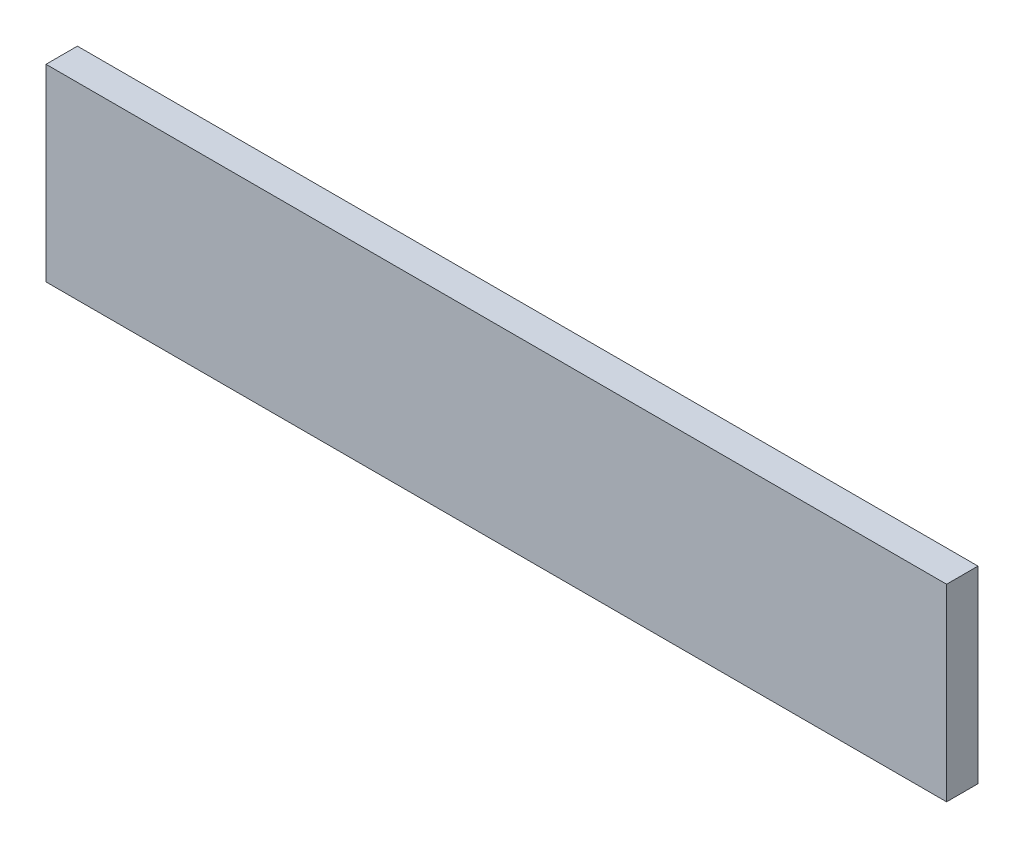
ISO-10303-21;
HEADER;
FILE_DESCRIPTION(('STEP AP214'),'2;1');
FILE_NAME('part.step','',(''),(''),'','','');
FILE_SCHEMA(('AUTOMOTIVE_DESIGN { 1 0 10303 214 1 1 1 1 }'));
ENDSEC;
DATA;
#1=APPLICATION_CONTEXT('core data for automotive mechanical design processes');
#2=APPLICATION_PROTOCOL_DEFINITION('international standard','automotive_design',2000,#1);
#3=PRODUCT_CONTEXT('',#1,'mechanical');
#4=PRODUCT('Part','Part','',(#3));
#5=PRODUCT_RELATED_PRODUCT_CATEGORY('part','',(#4));
#6=PRODUCT_DEFINITION_FORMATION('','',#4);
#7=PRODUCT_DEFINITION_CONTEXT('part definition',#1,'design');
#8=PRODUCT_DEFINITION('design','',#6,#7);
#9=PRODUCT_DEFINITION_SHAPE('','',#8);
#10=(LENGTH_UNIT() NAMED_UNIT(*) SI_UNIT(.MILLI.,.METRE.));
#11=(NAMED_UNIT(*) PLANE_ANGLE_UNIT() SI_UNIT($,.RADIAN.));
#12=(NAMED_UNIT(*) SI_UNIT($,.STERADIAN.) SOLID_ANGLE_UNIT());
#13=UNCERTAINTY_MEASURE_WITH_UNIT(LENGTH_MEASURE(1.E-05),#10,'distance_accuracy_value','');
#14=(GEOMETRIC_REPRESENTATION_CONTEXT(3) GLOBAL_UNCERTAINTY_ASSIGNED_CONTEXT((#13)) GLOBAL_UNIT_ASSIGNED_CONTEXT((#10,
#11,#12)) REPRESENTATION_CONTEXT('',''));
#15=CARTESIAN_POINT('',(0.,0.,0.));
#16=DIRECTION('',(0.,0.,1.));
#17=DIRECTION('',(1.,0.,0.));
#18=AXIS2_PLACEMENT_3D('',#15,#16,#17);
#19=CARTESIAN_POINT('',(43.,-9.,3.));
#20=DIRECTION('',(-1.,0.,0.));
#21=DIRECTION('',(0.,0.,1.));
#22=AXIS2_PLACEMENT_3D('',#19,#20,#21);
#23=PLANE('',#22);
#24=DIRECTION('',(0.,1.,0.));
#25=VECTOR('',#24,1.);
#26=CARTESIAN_POINT('',(43.,-9.,0.));
#27=LINE('',#26,#25);
#28=CARTESIAN_POINT('',(43.,-9.,0.));
#29=VERTEX_POINT('',#28);
#30=CARTESIAN_POINT('',(43.,9.,0.));
#31=VERTEX_POINT('',#30);
#32=EDGE_CURVE('E107',#29,#31,#27,.T.);
#33=ORIENTED_EDGE('',*,*,#32,.T.);
#34=DIRECTION('',(0.,0.,-1.));
#35=VECTOR('',#34,1.);
#36=CARTESIAN_POINT('',(43.,9.,3.));
#37=LINE('',#36,#35);
#38=CARTESIAN_POINT('',(43.,9.,3.));
#39=VERTEX_POINT('',#38);
#40=EDGE_CURVE('E11',#39,#31,#37,.T.);
#41=ORIENTED_EDGE('',*,*,#40,.F.);
#42=DIRECTION('',(0.,1.,0.));
#43=VECTOR('',#42,1.);
#44=CARTESIAN_POINT('',(43.,-9.,3.));
#45=LINE('',#44,#43);
#46=CARTESIAN_POINT('',(43.,-9.,3.));
#47=VERTEX_POINT('',#46);
#48=EDGE_CURVE('E91',#47,#39,#45,.T.);
#49=ORIENTED_EDGE('',*,*,#48,.F.);
#50=DIRECTION('',(0.,0.,-1.));
#51=VECTOR('',#50,1.);
#52=CARTESIAN_POINT('',(43.,-9.,3.));
#53=LINE('',#52,#51);
#54=EDGE_CURVE('E103',#47,#29,#53,.T.);
#55=ORIENTED_EDGE('',*,*,#54,.T.);
#56=EDGE_LOOP('',(#33,#41,#49,#55));
#57=FACE_BOUND('',#56,.T.);
#58=ADVANCED_FACE('F39',(#57),#23,.F.);
#59=CARTESIAN_POINT('',(-43.,9.,3.));
#60=DIRECTION('',(0.,-1.,0.));
#61=DIRECTION('',(0.,0.,-1.));
#62=AXIS2_PLACEMENT_3D('',#59,#60,#61);
#63=PLANE('',#62);
#64=DIRECTION('',(-1.,0.,0.));
#65=VECTOR('',#64,1.);
#66=CARTESIAN_POINT('',(-43.,9.,0.));
#67=LINE('',#66,#65);
#68=CARTESIAN_POINT('',(-43.,9.,0.));
#69=VERTEX_POINT('',#68);
#70=EDGE_CURVE('E96',#31,#69,#67,.T.);
#71=ORIENTED_EDGE('',*,*,#70,.T.);
#72=DIRECTION('',(0.,0.,-1.));
#73=VECTOR('',#72,1.);
#74=CARTESIAN_POINT('',(-43.,9.,3.));
#75=LINE('',#74,#73);
#76=CARTESIAN_POINT('',(-43.,9.,3.));
#77=VERTEX_POINT('',#76);
#78=EDGE_CURVE('E48',#77,#69,#75,.T.);
#79=ORIENTED_EDGE('',*,*,#78,.F.);
#80=DIRECTION('',(-1.,0.,0.));
#81=VECTOR('',#80,1.);
#82=CARTESIAN_POINT('',(-43.,9.,3.));
#83=LINE('',#82,#81);
#84=EDGE_CURVE('E86',#39,#77,#83,.T.);
#85=ORIENTED_EDGE('',*,*,#84,.F.);
#86=ORIENTED_EDGE('',*,*,#40,.T.);
#87=EDGE_LOOP('',(#71,#79,#85,#86));
#88=FACE_BOUND('',#87,.T.);
#89=ADVANCED_FACE('F95',(#88),#63,.F.);
#90=CARTESIAN_POINT('',(-43.,-9.,3.));
#91=DIRECTION('',(1.,0.,0.));
#92=DIRECTION('',(0.,0.,-1.));
#93=AXIS2_PLACEMENT_3D('',#90,#91,#92);
#94=PLANE('',#93);
#95=DIRECTION('',(0.,-1.,0.));
#96=VECTOR('',#95,1.);
#97=CARTESIAN_POINT('',(-43.,-9.,0.));
#98=LINE('',#97,#96);
#99=CARTESIAN_POINT('',(-43.,-9.,0.));
#100=VERTEX_POINT('',#99);
#101=EDGE_CURVE('E73',#69,#100,#98,.T.);
#102=ORIENTED_EDGE('',*,*,#101,.T.);
#103=DIRECTION('',(0.,0.,-1.));
#104=VECTOR('',#103,1.);
#105=CARTESIAN_POINT('',(-43.,-9.,3.));
#106=LINE('',#105,#104);
#107=CARTESIAN_POINT('',(-43.,-9.,3.));
#108=VERTEX_POINT('',#107);
#109=EDGE_CURVE('E98',#108,#100,#106,.T.);
#110=ORIENTED_EDGE('',*,*,#109,.F.);
#111=DIRECTION('',(0.,-1.,0.));
#112=VECTOR('',#111,1.);
#113=CARTESIAN_POINT('',(-43.,-9.,3.));
#114=LINE('',#113,#112);
#115=EDGE_CURVE('E89',#77,#108,#114,.T.);
#116=ORIENTED_EDGE('',*,*,#115,.F.);
#117=ORIENTED_EDGE('',*,*,#78,.T.);
#118=EDGE_LOOP('',(#102,#110,#116,#117));
#119=FACE_BOUND('',#118,.T.);
#120=ADVANCED_FACE('F99',(#119),#94,.F.);
#121=CARTESIAN_POINT('',(-43.,-9.,3.));
#122=DIRECTION('',(0.,1.,0.));
#123=DIRECTION('',(0.,0.,1.));
#124=AXIS2_PLACEMENT_3D('',#121,#122,#123);
#125=PLANE('',#124);
#126=DIRECTION('',(1.,0.,0.));
#127=VECTOR('',#126,1.);
#128=CARTESIAN_POINT('',(-43.,-9.,0.));
#129=LINE('',#128,#127);
#130=EDGE_CURVE('E79',#100,#29,#129,.T.);
#131=ORIENTED_EDGE('',*,*,#130,.T.);
#132=ORIENTED_EDGE('',*,*,#54,.F.);
#133=DIRECTION('',(1.,0.,0.));
#134=VECTOR('',#133,1.);
#135=CARTESIAN_POINT('',(-43.,-9.,3.));
#136=LINE('',#135,#134);
#137=EDGE_CURVE('E56',#108,#47,#136,.T.);
#138=ORIENTED_EDGE('',*,*,#137,.F.);
#139=ORIENTED_EDGE('',*,*,#109,.T.);
#140=EDGE_LOOP('',(#131,#132,#138,#139));
#141=FACE_BOUND('',#140,.T.);
#142=ADVANCED_FACE('F120',(#141),#125,.F.);
#143=CARTESIAN_POINT('',(0.,0.,3.));
#144=DIRECTION('',(0.,0.,-1.));
#145=DIRECTION('',(-1.,0.,0.));
#146=AXIS2_PLACEMENT_3D('',#143,#144,#145);
#147=PLANE('',#146);
#148=ORIENTED_EDGE('',*,*,#48,.T.);
#149=ORIENTED_EDGE('',*,*,#84,.T.);
#150=ORIENTED_EDGE('',*,*,#115,.T.);
#151=ORIENTED_EDGE('',*,*,#137,.T.);
#152=EDGE_LOOP('',(#148,#149,#150,#151));
#153=FACE_BOUND('',#152,.T.);
#154=ADVANCED_FACE('F87',(#153),#147,.F.);
#155=CARTESIAN_POINT('',(0.,0.,0.));
#156=DIRECTION('',(0.,0.,-1.));
#157=DIRECTION('',(-1.,0.,0.));
#158=AXIS2_PLACEMENT_3D('',#155,#156,#157);
#159=PLANE('',#158);
#160=ORIENTED_EDGE('',*,*,#32,.F.);
#161=ORIENTED_EDGE('',*,*,#130,.F.);
#162=ORIENTED_EDGE('',*,*,#101,.F.);
#163=ORIENTED_EDGE('',*,*,#70,.F.);
#164=EDGE_LOOP('',(#160,#161,#162,#163));
#165=FACE_BOUND('',#164,.T.);
#166=ADVANCED_FACE('F123',(#165),#159,.T.);
#167=CLOSED_SHELL('',(#58,#89,#120,#142,#154,#166));
#168=MANIFOLD_SOLID_BREP('B2',#167);
#169=ADVANCED_BREP_SHAPE_REPRESENTATION('',(#18,#168),#14);
#170=SHAPE_DEFINITION_REPRESENTATION(#9,#169);
ENDSEC;
END-ISO-10303-21;
